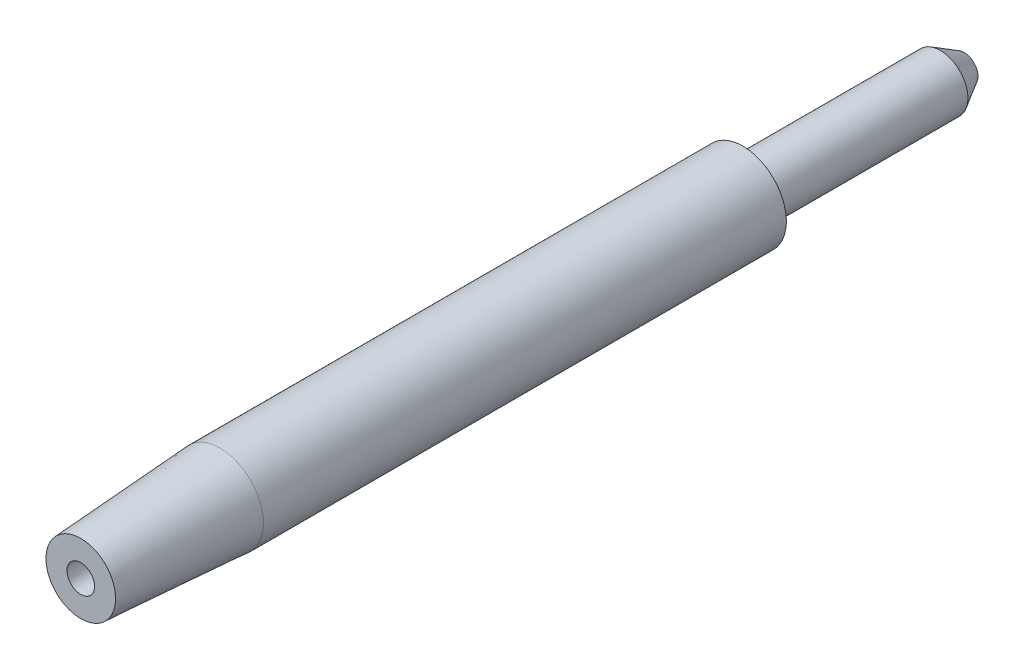
ISO-10303-21;
HEADER;
FILE_DESCRIPTION(('STEP AP214'),'2;1');
FILE_NAME('part.step','',(''),(''),'','','');
FILE_SCHEMA(('AUTOMOTIVE_DESIGN { 1 0 10303 214 1 1 1 1 }'));
ENDSEC;
DATA;
#1=APPLICATION_CONTEXT('core data for automotive mechanical design processes');
#2=APPLICATION_PROTOCOL_DEFINITION('international standard','automotive_design',2000,#1);
#3=PRODUCT_CONTEXT('',#1,'mechanical');
#4=PRODUCT('Part','Part','',(#3));
#5=PRODUCT_RELATED_PRODUCT_CATEGORY('part','',(#4));
#6=PRODUCT_DEFINITION_FORMATION('','',#4);
#7=PRODUCT_DEFINITION_CONTEXT('part definition',#1,'design');
#8=PRODUCT_DEFINITION('design','',#6,#7);
#9=PRODUCT_DEFINITION_SHAPE('','',#8);
#10=(LENGTH_UNIT() NAMED_UNIT(*) SI_UNIT(.MILLI.,.METRE.));
#11=(NAMED_UNIT(*) PLANE_ANGLE_UNIT() SI_UNIT($,.RADIAN.));
#12=(NAMED_UNIT(*) SI_UNIT($,.STERADIAN.) SOLID_ANGLE_UNIT());
#13=UNCERTAINTY_MEASURE_WITH_UNIT(LENGTH_MEASURE(1.E-05),#10,'distance_accuracy_value','');
#14=(GEOMETRIC_REPRESENTATION_CONTEXT(3) GLOBAL_UNCERTAINTY_ASSIGNED_CONTEXT((#13)) GLOBAL_UNIT_ASSIGNED_CONTEXT((#10,
#11,#12)) REPRESENTATION_CONTEXT('',''));
#15=CARTESIAN_POINT('',(0.,0.,0.));
#16=DIRECTION('',(0.,0.,1.));
#17=DIRECTION('',(1.,0.,0.));
#18=AXIS2_PLACEMENT_3D('',#15,#16,#17);
#19=CARTESIAN_POINT('',(-6.27037222048295,0.,12.7));
#20=DIRECTION('',(0.,0.,-1.));
#21=DIRECTION('',(-1.,0.,0.));
#22=AXIS2_PLACEMENT_3D('',#19,#20,#21);
#23=PLANE('',#22);
#24=CARTESIAN_POINT('',(-4.68287222048293,0.,12.7));
#25=DIRECTION('',(0.,0.,-1.));
#26=DIRECTION('',(-1.,0.,0.));
#27=AXIS2_PLACEMENT_3D('',#24,#25,#26);
#28=CIRCLE('',#27,2.49999999999999);
#29=CARTESIAN_POINT('',(-7.18287222048292,0.,12.7));
#30=VERTEX_POINT('',#29);
#31=EDGE_CURVE('E56',#30,#30,#28,.T.);
#32=ORIENTED_EDGE('',*,*,#31,.T.);
#33=EDGE_LOOP('',(#32));
#34=FACE_BOUND('',#33,.T.);
#35=CARTESIAN_POINT('',(-4.68287222048293,0.,12.7));
#36=DIRECTION('',(0.,0.,-1.));
#37=DIRECTION('',(-1.,0.,0.));
#38=AXIS2_PLACEMENT_3D('',#35,#36,#37);
#39=CIRCLE('',#38,1.58750000000002);
#40=CARTESIAN_POINT('',(-6.27037222048295,0.,12.7));
#41=VERTEX_POINT('',#40);
#42=EDGE_CURVE('E10',#41,#41,#39,.T.);
#43=ORIENTED_EDGE('',*,*,#42,.F.);
#44=EDGE_LOOP('',(#43));
#45=FACE_BOUND('',#44,.T.);
#46=ADVANCED_FACE('F31',(#34,#45),#23,.T.);
#47=CARTESIAN_POINT('',(-4.68287222048292,0.,-12.7332814466144));
#48=DIRECTION('',(0.,0.,-1.));
#49=DIRECTION('',(-1.,0.,0.));
#50=AXIS2_PLACEMENT_3D('',#47,#48,#49);
#51=CYLINDRICAL_SURFACE('',#50,1.58750000000002);
#52=ORIENTED_EDGE('',*,*,#42,.T.);
#53=EDGE_LOOP('',(#52));
#54=FACE_BOUND('',#53,.T.);
#55=CARTESIAN_POINT('',(-4.68287222048293,0.,1.34773543230412));
#56=DIRECTION('',(0.,0.,-1.));
#57=DIRECTION('',(-1.,0.,0.));
#58=AXIS2_PLACEMENT_3D('',#55,#56,#57);
#59=CIRCLE('',#58,1.58750000000002);
#60=CARTESIAN_POINT('',(-6.27037222048295,0.,1.34773543230411));
#61=VERTEX_POINT('',#60);
#62=EDGE_CURVE('E37',#61,#61,#59,.T.);
#63=ORIENTED_EDGE('',*,*,#62,.F.);
#64=EDGE_LOOP('',(#63));
#65=FACE_BOUND('',#64,.T.);
#66=ADVANCED_FACE('F74',(#54,#65),#51,.T.);
#67=CARTESIAN_POINT('',(-4.68287222048293,0.,-0.0270798962037355));
#68=DIRECTION('',(0.,0.,1.));
#69=DIRECTION('',(1.,0.,0.));
#70=AXIS2_PLACEMENT_3D('',#67,#68,#69);
#71=CONICAL_SURFACE('',#70,0.793749999999993,0.523598775598297);
#72=ORIENTED_EDGE('',*,*,#62,.T.);
#73=EDGE_LOOP('',(#72));
#74=FACE_BOUND('',#73,.T.);
#75=CARTESIAN_POINT('',(-4.68287222048293,0.,-0.0270798962037355));
#76=DIRECTION('',(0.,0.,-1.));
#77=DIRECTION('',(-1.,0.,0.));
#78=AXIS2_PLACEMENT_3D('',#75,#76,#77);
#79=CIRCLE('',#78,0.793749999999993);
#80=CARTESIAN_POINT('',(-5.47662222048292,0.,-0.0270798962037359));
#81=VERTEX_POINT('',#80);
#82=EDGE_CURVE('E41',#81,#81,#79,.T.);
#83=ORIENTED_EDGE('',*,*,#82,.F.);
#84=EDGE_LOOP('',(#83));
#85=FACE_BOUND('',#84,.T.);
#86=ADVANCED_FACE('F78',(#74,#85),#71,.T.);
#87=CARTESIAN_POINT('',(-4.68287222048292,0.,-12.7332814466144));
#88=DIRECTION('',(0.,0.,-1.));
#89=DIRECTION('',(-1.,0.,0.));
#90=AXIS2_PLACEMENT_3D('',#87,#88,#89);
#91=CYLINDRICAL_SURFACE('',#90,0.793749999999981);
#92=ORIENTED_EDGE('',*,*,#82,.T.);
#93=EDGE_LOOP('',(#92));
#94=FACE_BOUND('',#93,.T.);
#95=CARTESIAN_POINT('',(-4.68287222048295,0.,50.7667185533856));
#96=DIRECTION('',(0.,0.,-1.));
#97=DIRECTION('',(-1.,0.,0.));
#98=AXIS2_PLACEMENT_3D('',#95,#96,#97);
#99=CIRCLE('',#98,0.793749999999968);
#100=CARTESIAN_POINT('',(-5.47662222048292,0.,50.7667185533856));
#101=VERTEX_POINT('',#100);
#102=EDGE_CURVE('E45',#101,#101,#99,.T.);
#103=ORIENTED_EDGE('',*,*,#102,.F.);
#104=EDGE_LOOP('',(#103));
#105=FACE_BOUND('',#104,.T.);
#106=ADVANCED_FACE('F82',(#94,#105),#91,.F.);
#107=CARTESIAN_POINT('',(-6.68287222048296,0.,50.7667185533856));
#108=DIRECTION('',(0.,0.,1.));
#109=DIRECTION('',(1.,0.,0.));
#110=AXIS2_PLACEMENT_3D('',#107,#108,#109);
#111=PLANE('',#110);
#112=ORIENTED_EDGE('',*,*,#102,.T.);
#113=EDGE_LOOP('',(#112));
#114=FACE_BOUND('',#113,.T.);
#115=CARTESIAN_POINT('',(-4.68287222048295,0.,50.7667185533856));
#116=DIRECTION('',(0.,0.,-1.));
#117=DIRECTION('',(-1.,0.,0.));
#118=AXIS2_PLACEMENT_3D('',#115,#116,#117);
#119=CIRCLE('',#118,2.);
#120=CARTESIAN_POINT('',(-6.68287222048296,0.,50.7667185533856));
#121=VERTEX_POINT('',#120);
#122=EDGE_CURVE('E50',#121,#121,#119,.T.);
#123=ORIENTED_EDGE('',*,*,#122,.F.);
#124=EDGE_LOOP('',(#123));
#125=FACE_BOUND('',#124,.T.);
#126=ADVANCED_FACE('F70',(#114,#125),#111,.T.);
#127=CARTESIAN_POINT('',(-4.68287222048295,0.,42.7667185533856));
#128=DIRECTION('',(0.,0.,-1.));
#129=DIRECTION('',(-1.,0.,0.));
#130=AXIS2_PLACEMENT_3D('',#127,#128,#129);
#131=CONICAL_SURFACE('',#130,2.49999999999997,0.0624188099959539);
#132=ORIENTED_EDGE('',*,*,#122,.T.);
#133=EDGE_LOOP('',(#132));
#134=FACE_BOUND('',#133,.T.);
#135=CARTESIAN_POINT('',(-4.68287222048295,0.,42.7667185533856));
#136=DIRECTION('',(0.,0.,-1.));
#137=DIRECTION('',(-1.,0.,0.));
#138=AXIS2_PLACEMENT_3D('',#135,#136,#137);
#139=CIRCLE('',#138,2.49999999999997);
#140=CARTESIAN_POINT('',(-7.18287222048292,0.,42.7667185533856));
#141=VERTEX_POINT('',#140);
#142=EDGE_CURVE('E53',#141,#141,#139,.T.);
#143=ORIENTED_EDGE('',*,*,#142,.F.);
#144=EDGE_LOOP('',(#143));
#145=FACE_BOUND('',#144,.T.);
#146=ADVANCED_FACE('F64',(#134,#145),#131,.T.);
#147=CARTESIAN_POINT('',(-4.68287222048292,0.,-12.7332814466144));
#148=DIRECTION('',(0.,0.,-1.));
#149=DIRECTION('',(-1.,0.,0.));
#150=AXIS2_PLACEMENT_3D('',#147,#148,#149);
#151=CYLINDRICAL_SURFACE('',#150,2.49999999999998);
#152=ORIENTED_EDGE('',*,*,#142,.T.);
#153=EDGE_LOOP('',(#152));
#154=FACE_BOUND('',#153,.T.);
#155=ORIENTED_EDGE('',*,*,#31,.F.);
#156=EDGE_LOOP('',(#155));
#157=FACE_BOUND('',#156,.T.);
#158=ADVANCED_FACE('F62',(#154,#157),#151,.T.);
#159=CLOSED_SHELL('',(#46,#66,#86,#106,#126,#146,#158));
#160=MANIFOLD_SOLID_BREP('B2',#159);
#161=ADVANCED_BREP_SHAPE_REPRESENTATION('',(#18,#160),#14);
#162=SHAPE_DEFINITION_REPRESENTATION(#9,#161);
ENDSEC;
END-ISO-10303-21;
